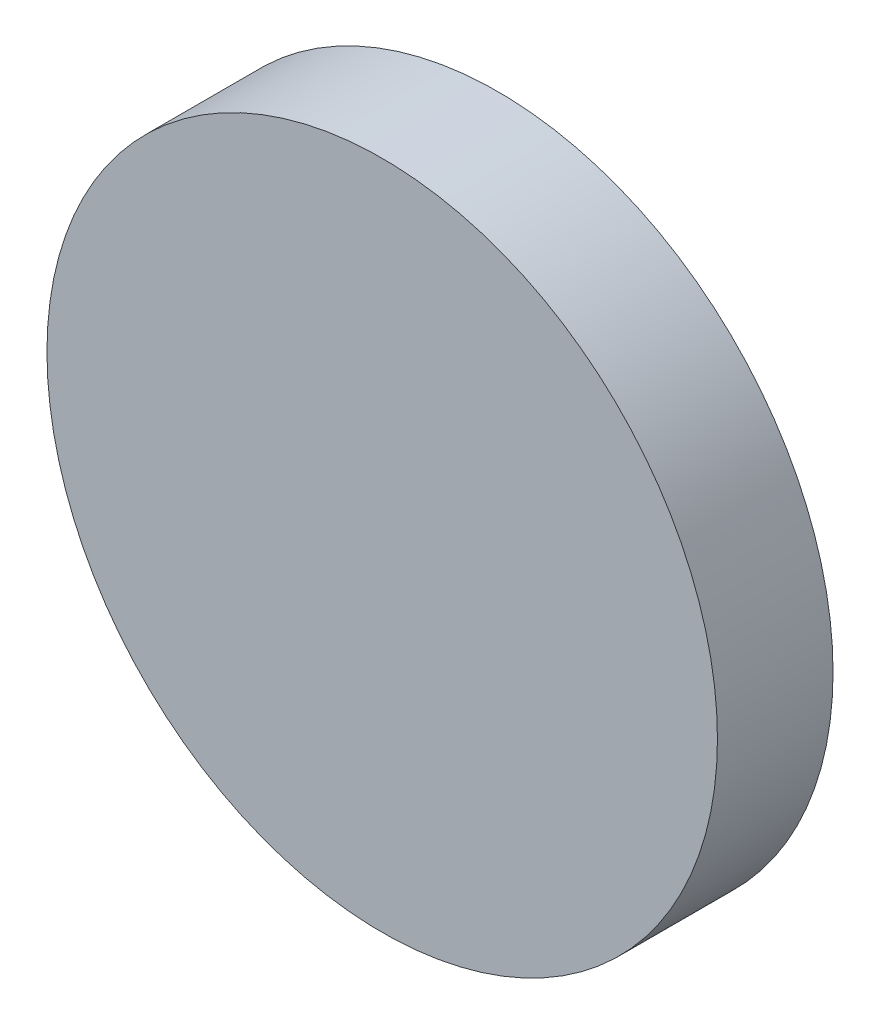
ISO-10303-21;
HEADER;
FILE_DESCRIPTION(('STEP AP214'),'2;1');
FILE_NAME('part.step','',(''),(''),'','','');
FILE_SCHEMA(('AUTOMOTIVE_DESIGN { 1 0 10303 214 1 1 1 1 }'));
ENDSEC;
DATA;
#1=APPLICATION_CONTEXT('core data for automotive mechanical design processes');
#2=APPLICATION_PROTOCOL_DEFINITION('international standard','automotive_design',2000,#1);
#3=PRODUCT_CONTEXT('',#1,'mechanical');
#4=PRODUCT('Part','Part','',(#3));
#5=PRODUCT_RELATED_PRODUCT_CATEGORY('part','',(#4));
#6=PRODUCT_DEFINITION_FORMATION('','',#4);
#7=PRODUCT_DEFINITION_CONTEXT('part definition',#1,'design');
#8=PRODUCT_DEFINITION('design','',#6,#7);
#9=PRODUCT_DEFINITION_SHAPE('','',#8);
#10=(LENGTH_UNIT() NAMED_UNIT(*) SI_UNIT(.MILLI.,.METRE.));
#11=(NAMED_UNIT(*) PLANE_ANGLE_UNIT() SI_UNIT($,.RADIAN.));
#12=(NAMED_UNIT(*) SI_UNIT($,.STERADIAN.) SOLID_ANGLE_UNIT());
#13=UNCERTAINTY_MEASURE_WITH_UNIT(LENGTH_MEASURE(1.E-05),#10,'distance_accuracy_value','');
#14=(GEOMETRIC_REPRESENTATION_CONTEXT(3) GLOBAL_UNCERTAINTY_ASSIGNED_CONTEXT((#13)) GLOBAL_UNIT_ASSIGNED_CONTEXT((#10,
#11,#12)) REPRESENTATION_CONTEXT('',''));
#15=CARTESIAN_POINT('',(0.,0.,0.));
#16=DIRECTION('',(0.,0.,1.));
#17=DIRECTION('',(1.,0.,0.));
#18=AXIS2_PLACEMENT_3D('',#15,#16,#17);
#19=CARTESIAN_POINT('',(0.,0.,10.));
#20=DIRECTION('',(0.,0.,-1.));
#21=DIRECTION('',(-1.,0.,0.));
#22=AXIS2_PLACEMENT_3D('',#19,#20,#21);
#23=CYLINDRICAL_SURFACE('',#22,29.);
#24=CARTESIAN_POINT('',(0.,0.,10.));
#25=DIRECTION('',(0.,0.,1.));
#26=DIRECTION('',(1.,0.,0.));
#27=AXIS2_PLACEMENT_3D('',#24,#25,#26);
#28=CIRCLE('',#27,29.);
#29=CARTESIAN_POINT('',(29.,0.,10.));
#30=VERTEX_POINT('',#29);
#31=EDGE_CURVE('E10',#30,#30,#28,.T.);
#32=ORIENTED_EDGE('',*,*,#31,.F.);
#33=EDGE_LOOP('',(#32));
#34=FACE_BOUND('',#33,.T.);
#35=CARTESIAN_POINT('',(0.,0.,0.));
#36=DIRECTION('',(0.,0.,1.));
#37=DIRECTION('',(1.,0.,0.));
#38=AXIS2_PLACEMENT_3D('',#35,#36,#37);
#39=CIRCLE('',#38,29.);
#40=CARTESIAN_POINT('',(29.,0.,0.));
#41=VERTEX_POINT('',#40);
#42=EDGE_CURVE('E40',#41,#41,#39,.T.);
#43=ORIENTED_EDGE('',*,*,#42,.T.);
#44=EDGE_LOOP('',(#43));
#45=FACE_BOUND('',#44,.T.);
#46=ADVANCED_FACE('F37',(#34,#45),#23,.T.);
#47=CARTESIAN_POINT('',(0.,0.,10.));
#48=DIRECTION('',(0.,0.,1.));
#49=DIRECTION('',(1.,0.,0.));
#50=AXIS2_PLACEMENT_3D('',#47,#48,#49);
#51=PLANE('',#50);
#52=ORIENTED_EDGE('',*,*,#31,.T.);
#53=EDGE_LOOP('',(#52));
#54=FACE_BOUND('',#53,.T.);
#55=ADVANCED_FACE('F54',(#54),#51,.T.);
#56=CARTESIAN_POINT('',(0.,0.,0.));
#57=DIRECTION('',(0.,0.,1.));
#58=DIRECTION('',(1.,0.,0.));
#59=AXIS2_PLACEMENT_3D('',#56,#57,#58);
#60=PLANE('',#59);
#61=ORIENTED_EDGE('',*,*,#42,.F.);
#62=EDGE_LOOP('',(#61));
#63=FACE_BOUND('',#62,.T.);
#64=ADVANCED_FACE('F52',(#63),#60,.F.);
#65=CLOSED_SHELL('',(#46,#55,#64));
#66=MANIFOLD_SOLID_BREP('B2',#65);
#67=ADVANCED_BREP_SHAPE_REPRESENTATION('',(#18,#66),#14);
#68=SHAPE_DEFINITION_REPRESENTATION(#9,#67);
ENDSEC;
END-ISO-10303-21;
